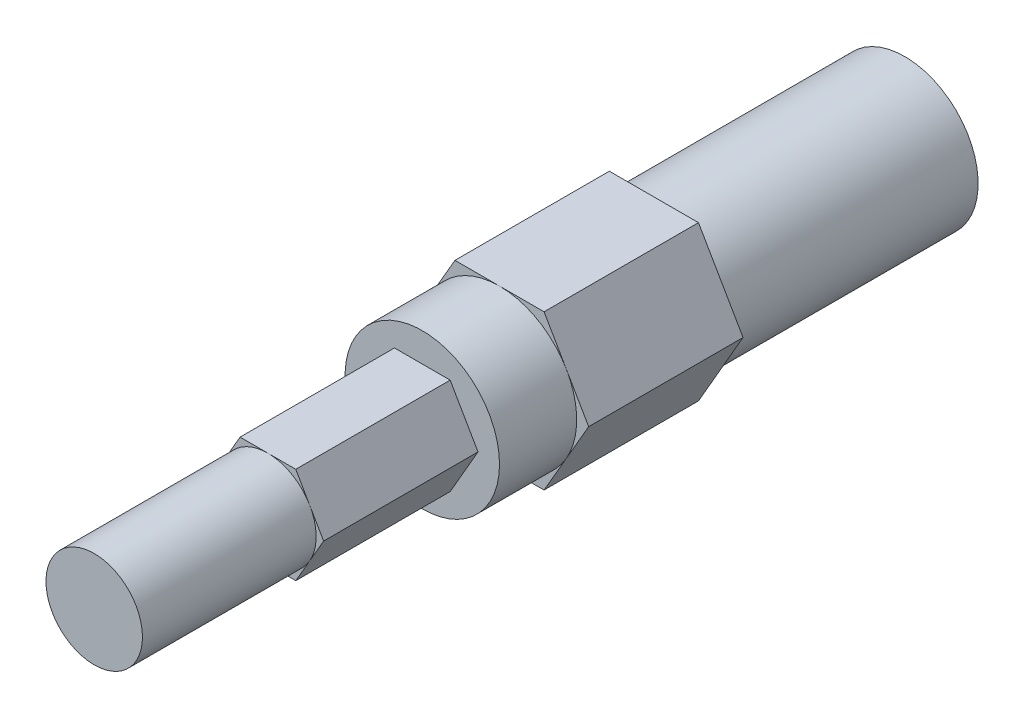
ISO-10303-21;
HEADER;
FILE_DESCRIPTION(('STEP AP214'),'2;1');
FILE_NAME('part.step','',(''),(''),'','','');
FILE_SCHEMA(('AUTOMOTIVE_DESIGN { 1 0 10303 214 1 1 1 1 }'));
ENDSEC;
DATA;
#1=APPLICATION_CONTEXT('core data for automotive mechanical design processes');
#2=APPLICATION_PROTOCOL_DEFINITION('international standard','automotive_design',2000,#1);
#3=PRODUCT_CONTEXT('',#1,'mechanical');
#4=PRODUCT('Part','Part','',(#3));
#5=PRODUCT_RELATED_PRODUCT_CATEGORY('part','',(#4));
#6=PRODUCT_DEFINITION_FORMATION('','',#4);
#7=PRODUCT_DEFINITION_CONTEXT('part definition',#1,'design');
#8=PRODUCT_DEFINITION('design','',#6,#7);
#9=PRODUCT_DEFINITION_SHAPE('','',#8);
#10=(LENGTH_UNIT() NAMED_UNIT(*) SI_UNIT(.MILLI.,.METRE.));
#11=(NAMED_UNIT(*) PLANE_ANGLE_UNIT() SI_UNIT($,.RADIAN.));
#12=(NAMED_UNIT(*) SI_UNIT($,.STERADIAN.) SOLID_ANGLE_UNIT());
#13=UNCERTAINTY_MEASURE_WITH_UNIT(LENGTH_MEASURE(1.E-05),#10,'distance_accuracy_value','');
#14=(GEOMETRIC_REPRESENTATION_CONTEXT(3) GLOBAL_UNCERTAINTY_ASSIGNED_CONTEXT((#13)) GLOBAL_UNIT_ASSIGNED_CONTEXT((#10,
#11,#12)) REPRESENTATION_CONTEXT('',''));
#15=CARTESIAN_POINT('',(0.,0.,0.));
#16=DIRECTION('',(0.,0.,1.));
#17=DIRECTION('',(1.,0.,0.));
#18=AXIS2_PLACEMENT_3D('',#15,#16,#17);
#19=CARTESIAN_POINT('',(0.,0.,13.335));
#20=DIRECTION('',(0.,0.,-1.));
#21=DIRECTION('',(-1.,0.,0.));
#22=AXIS2_PLACEMENT_3D('',#19,#20,#21);
#23=CYLINDRICAL_SURFACE('',#22,2.413);
#24=CARTESIAN_POINT('',(0.,0.,13.335));
#25=DIRECTION('',(0.,0.,1.));
#26=DIRECTION('',(1.,0.,0.));
#27=AXIS2_PLACEMENT_3D('',#24,#25,#26);
#28=CIRCLE('',#27,2.413);
#29=CARTESIAN_POINT('',(2.413,0.,13.335));
#30=VERTEX_POINT('',#29);
#31=EDGE_CURVE('E41',#30,#30,#28,.T.);
#32=ORIENTED_EDGE('',*,*,#31,.F.);
#33=EDGE_LOOP('',(#32));
#34=FACE_BOUND('',#33,.T.);
#35=CARTESIAN_POINT('',(0.,0.,5.08));
#36=DIRECTION('',(0.,0.,-1.));
#37=DIRECTION('',(-1.,0.,0.));
#38=AXIS2_PLACEMENT_3D('',#35,#36,#37);
#39=CIRCLE('',#38,2.413);
#40=CARTESIAN_POINT('',(-2.413,0.,5.08));
#41=VERTEX_POINT('',#40);
#42=EDGE_CURVE('E194',#41,#41,#39,.T.);
#43=ORIENTED_EDGE('',*,*,#42,.F.);
#44=EDGE_LOOP('',(#43));
#45=FACE_BOUND('',#44,.T.);
#46=ADVANCED_FACE('F38',(#34,#45),#23,.T.);
#47=CARTESIAN_POINT('',(0.,0.,26.035));
#48=DIRECTION('',(0.,0.,1.));
#49=DIRECTION('',(1.,0.,0.));
#50=AXIS2_PLACEMENT_3D('',#47,#48,#49);
#51=PLANE('',#50);
#52=CARTESIAN_POINT('',(0.,0.,26.035));
#53=DIRECTION('',(0.,0.,1.));
#54=DIRECTION('',(1.,0.,0.));
#55=AXIS2_PLACEMENT_3D('',#52,#53,#54);
#56=CIRCLE('',#55,1.5875);
#57=CARTESIAN_POINT('',(1.3748153285078,0.79375,26.035));
#58=VERTEX_POINT('',#57);
#59=CARTESIAN_POINT('',(0.,1.5875,26.035));
#60=VERTEX_POINT('',#59);
#61=EDGE_CURVE('E48',#58,#60,#56,.T.);
#62=ORIENTED_EDGE('',*,*,#61,.F.);
#63=DIRECTION('',(-0.5,0.866025403784438,0.));
#64=VECTOR('',#63,1.);
#65=CARTESIAN_POINT('',(1.83308710467706,0.,26.035));
#66=LINE('',#65,#64);
#67=CARTESIAN_POINT('',(0.916543552338529,1.5875,26.035));
#68=VERTEX_POINT('',#67);
#69=EDGE_CURVE('E177',#58,#68,#66,.T.);
#70=ORIENTED_EDGE('',*,*,#69,.T.);
#71=DIRECTION('',(-1.,0.,0.));
#72=VECTOR('',#71,1.);
#73=CARTESIAN_POINT('',(0.916543552338529,1.5875,26.035));
#74=LINE('',#73,#72);
#75=EDGE_CURVE('E191',#68,#60,#74,.T.);
#76=ORIENTED_EDGE('',*,*,#75,.T.);
#77=EDGE_LOOP('',(#62,#70,#76));
#78=FACE_BOUND('',#77,.T.);
#79=ADVANCED_FACE('F190',(#78),#51,.T.);
#80=CARTESIAN_POINT('',(-1.3748153285078,0.79375,26.035));
#81=VERTEX_POINT('',#80);
#82=EDGE_CURVE('E11',#60,#81,#56,.T.);
#83=ORIENTED_EDGE('',*,*,#82,.F.);
#84=CARTESIAN_POINT('',(-0.916543552338531,1.5875,26.035));
#85=VERTEX_POINT('',#84);
#86=EDGE_CURVE('E176',#60,#85,#74,.T.);
#87=ORIENTED_EDGE('',*,*,#86,.T.);
#88=DIRECTION('',(-0.5,-0.866025403784439,0.));
#89=VECTOR('',#88,1.);
#90=CARTESIAN_POINT('',(-0.916543552338531,1.5875,26.035));
#91=LINE('',#90,#89);
#92=EDGE_CURVE('E207',#85,#81,#91,.T.);
#93=ORIENTED_EDGE('',*,*,#92,.T.);
#94=EDGE_LOOP('',(#83,#87,#93));
#95=FACE_BOUND('',#94,.T.);
#96=ADVANCED_FACE('F370',(#95),#51,.T.);
#97=CARTESIAN_POINT('',(-1.3748153285078,-0.793750000000001,26.035));
#98=VERTEX_POINT('',#97);
#99=EDGE_CURVE('E46',#81,#98,#56,.T.);
#100=ORIENTED_EDGE('',*,*,#99,.F.);
#101=CARTESIAN_POINT('',(-1.83308710467706,0.,26.035));
#102=VERTEX_POINT('',#101);
#103=EDGE_CURVE('E206',#81,#102,#91,.T.);
#104=ORIENTED_EDGE('',*,*,#103,.T.);
#105=DIRECTION('',(0.5,-0.866025403784439,0.));
#106=VECTOR('',#105,1.);
#107=CARTESIAN_POINT('',(-1.83308710467706,0.,26.035));
#108=LINE('',#107,#106);
#109=EDGE_CURVE('E211',#102,#98,#108,.T.);
#110=ORIENTED_EDGE('',*,*,#109,.T.);
#111=EDGE_LOOP('',(#100,#104,#110));
#112=FACE_BOUND('',#111,.T.);
#113=ADVANCED_FACE('F458',(#112),#51,.T.);
#114=CARTESIAN_POINT('',(0.,-1.5875,26.035));
#115=VERTEX_POINT('',#114);
#116=EDGE_CURVE('E63',#98,#115,#56,.T.);
#117=ORIENTED_EDGE('',*,*,#116,.F.);
#118=CARTESIAN_POINT('',(-0.916543552338531,-1.5875,26.035));
#119=VERTEX_POINT('',#118);
#120=EDGE_CURVE('E210',#98,#119,#108,.T.);
#121=ORIENTED_EDGE('',*,*,#120,.T.);
#122=DIRECTION('',(1.,0.,0.));
#123=VECTOR('',#122,1.);
#124=CARTESIAN_POINT('',(-0.916543552338531,-1.5875,26.035));
#125=LINE('',#124,#123);
#126=EDGE_CURVE('E215',#119,#115,#125,.T.);
#127=ORIENTED_EDGE('',*,*,#126,.T.);
#128=EDGE_LOOP('',(#117,#121,#127));
#129=FACE_BOUND('',#128,.T.);
#130=ADVANCED_FACE('F454',(#129),#51,.T.);
#131=CARTESIAN_POINT('',(1.3748153285078,-0.79375,26.035));
#132=VERTEX_POINT('',#131);
#133=EDGE_CURVE('E55',#115,#132,#56,.T.);
#134=ORIENTED_EDGE('',*,*,#133,.F.);
#135=CARTESIAN_POINT('',(0.916543552338531,-1.5875,26.035));
#136=VERTEX_POINT('',#135);
#137=EDGE_CURVE('E214',#115,#136,#125,.T.);
#138=ORIENTED_EDGE('',*,*,#137,.T.);
#139=DIRECTION('',(0.5,0.866025403784439,0.));
#140=VECTOR('',#139,1.);
#141=CARTESIAN_POINT('',(0.916543552338531,-1.5875,26.035));
#142=LINE('',#141,#140);
#143=EDGE_CURVE('E188',#136,#132,#142,.T.);
#144=ORIENTED_EDGE('',*,*,#143,.T.);
#145=EDGE_LOOP('',(#134,#138,#144));
#146=FACE_BOUND('',#145,.T.);
#147=ADVANCED_FACE('F391',(#146),#51,.T.);
#148=CARTESIAN_POINT('',(0.,0.,18.415));
#149=DIRECTION('',(0.,0.,1.));
#150=DIRECTION('',(1.,0.,0.));
#151=AXIS2_PLACEMENT_3D('',#148,#149,#150);
#152=PLANE('',#151);
#153=CARTESIAN_POINT('',(0.,0.,18.415));
#154=DIRECTION('',(0.,0.,1.));
#155=DIRECTION('',(1.,0.,0.));
#156=AXIS2_PLACEMENT_3D('',#153,#154,#155);
#157=CIRCLE('',#156,2.54);
#158=CARTESIAN_POINT('',(2.19970452561247,1.27,18.415));
#159=VERTEX_POINT('',#158);
#160=CARTESIAN_POINT('',(0.,2.54,18.415));
#161=VERTEX_POINT('',#160);
#162=EDGE_CURVE('E200',#159,#161,#157,.T.);
#163=ORIENTED_EDGE('',*,*,#162,.F.);
#164=DIRECTION('',(-0.5,0.866025403784439,0.));
#165=VECTOR('',#164,1.);
#166=CARTESIAN_POINT('',(2.9329393674833,0.,18.415));
#167=LINE('',#166,#165);
#168=CARTESIAN_POINT('',(1.46646968374165,2.54,18.415));
#169=VERTEX_POINT('',#168);
#170=EDGE_CURVE('E258',#159,#169,#167,.T.);
#171=ORIENTED_EDGE('',*,*,#170,.T.);
#172=DIRECTION('',(-1.,0.,0.));
#173=VECTOR('',#172,1.);
#174=CARTESIAN_POINT('',(1.46646968374165,2.54,18.415));
#175=LINE('',#174,#173);
#176=EDGE_CURVE('E263',#169,#161,#175,.T.);
#177=ORIENTED_EDGE('',*,*,#176,.T.);
#178=EDGE_LOOP('',(#163,#171,#177));
#179=FACE_BOUND('',#178,.T.);
#180=ADVANCED_FACE('F427',(#179),#152,.T.);
#181=CARTESIAN_POINT('',(-2.19970452561248,1.27,18.415));
#182=VERTEX_POINT('',#181);
#183=EDGE_CURVE('E196',#161,#182,#157,.T.);
#184=ORIENTED_EDGE('',*,*,#183,.F.);
#185=CARTESIAN_POINT('',(-1.46646968374165,2.54,18.415));
#186=VERTEX_POINT('',#185);
#187=EDGE_CURVE('E262',#161,#186,#175,.T.);
#188=ORIENTED_EDGE('',*,*,#187,.T.);
#189=DIRECTION('',(-0.5,-0.866025403784439,0.));
#190=VECTOR('',#189,1.);
#191=CARTESIAN_POINT('',(-1.46646968374165,2.54,18.415));
#192=LINE('',#191,#190);
#193=EDGE_CURVE('E267',#186,#182,#192,.T.);
#194=ORIENTED_EDGE('',*,*,#193,.T.);
#195=EDGE_LOOP('',(#184,#188,#194));
#196=FACE_BOUND('',#195,.T.);
#197=ADVANCED_FACE('F329',(#196),#152,.T.);
#198=CARTESIAN_POINT('',(-2.19970452561248,-1.27,18.415));
#199=VERTEX_POINT('',#198);
#200=EDGE_CURVE('E198',#182,#199,#157,.T.);
#201=ORIENTED_EDGE('',*,*,#200,.F.);
#202=CARTESIAN_POINT('',(-2.9329393674833,0.,18.415));
#203=VERTEX_POINT('',#202);
#204=EDGE_CURVE('E266',#182,#203,#192,.T.);
#205=ORIENTED_EDGE('',*,*,#204,.T.);
#206=DIRECTION('',(0.5,-0.866025403784439,0.));
#207=VECTOR('',#206,1.);
#208=CARTESIAN_POINT('',(-2.9329393674833,0.,18.415));
#209=LINE('',#208,#207);
#210=EDGE_CURVE('E271',#203,#199,#209,.T.);
#211=ORIENTED_EDGE('',*,*,#210,.T.);
#212=EDGE_LOOP('',(#201,#205,#211));
#213=FACE_BOUND('',#212,.T.);
#214=ADVANCED_FACE('F322',(#213),#152,.T.);
#215=CARTESIAN_POINT('',(0.,-2.54,18.415));
#216=VERTEX_POINT('',#215);
#217=EDGE_CURVE('E316',#199,#216,#157,.T.);
#218=ORIENTED_EDGE('',*,*,#217,.F.);
#219=CARTESIAN_POINT('',(-1.46646968374165,-2.54,18.415));
#220=VERTEX_POINT('',#219);
#221=EDGE_CURVE('E270',#199,#220,#209,.T.);
#222=ORIENTED_EDGE('',*,*,#221,.T.);
#223=DIRECTION('',(1.,0.,0.));
#224=VECTOR('',#223,1.);
#225=CARTESIAN_POINT('',(-1.46646968374165,-2.54,18.415));
#226=LINE('',#225,#224);
#227=EDGE_CURVE('E275',#220,#216,#226,.T.);
#228=ORIENTED_EDGE('',*,*,#227,.T.);
#229=EDGE_LOOP('',(#218,#222,#228));
#230=FACE_BOUND('',#229,.T.);
#231=ADVANCED_FACE('F352',(#230),#152,.T.);
#232=CARTESIAN_POINT('',(2.19970452561248,-1.27,18.415));
#233=VERTEX_POINT('',#232);
#234=EDGE_CURVE('E313',#216,#233,#157,.T.);
#235=ORIENTED_EDGE('',*,*,#234,.F.);
#236=CARTESIAN_POINT('',(1.46646968374165,-2.54,18.415));
#237=VERTEX_POINT('',#236);
#238=EDGE_CURVE('E274',#216,#237,#226,.T.);
#239=ORIENTED_EDGE('',*,*,#238,.T.);
#240=DIRECTION('',(0.5,0.866025403784439,0.));
#241=VECTOR('',#240,1.);
#242=CARTESIAN_POINT('',(1.46646968374165,-2.54,18.415));
#243=LINE('',#242,#241);
#244=EDGE_CURVE('E255',#237,#233,#243,.T.);
#245=ORIENTED_EDGE('',*,*,#244,.T.);
#246=EDGE_LOOP('',(#235,#239,#245));
#247=FACE_BOUND('',#246,.T.);
#248=ADVANCED_FACE('F354',(#247),#152,.T.);
#249=CARTESIAN_POINT('',(1.46646968374165,-2.54,18.415));
#250=DIRECTION('',(-0.866025403784439,0.5,0.));
#251=DIRECTION('',(-0.5,-0.866025403784439,0.));
#252=AXIS2_PLACEMENT_3D('',#249,#250,#251);
#253=PLANE('',#252);
#254=DIRECTION('',(0.5,0.866025403784439,0.));
#255=VECTOR('',#254,1.);
#256=CARTESIAN_POINT('',(1.46646968374165,-2.54,13.335));
#257=LINE('',#256,#255);
#258=CARTESIAN_POINT('',(1.46646968374165,-2.54,13.335));
#259=VERTEX_POINT('',#258);
#260=CARTESIAN_POINT('',(2.9329393674833,0.,13.335));
#261=VERTEX_POINT('',#260);
#262=EDGE_CURVE('E251',#259,#261,#257,.T.);
#263=ORIENTED_EDGE('',*,*,#262,.T.);
#264=DIRECTION('',(0.,0.,-1.));
#265=VECTOR('',#264,1.);
#266=CARTESIAN_POINT('',(2.9329393674833,0.,18.415));
#267=LINE('',#266,#265);
#268=CARTESIAN_POINT('',(2.9329393674833,0.,18.415));
#269=VERTEX_POINT('',#268);
#270=EDGE_CURVE('E304',#269,#261,#267,.T.);
#271=ORIENTED_EDGE('',*,*,#270,.F.);
#272=EDGE_CURVE('E259',#233,#269,#243,.T.);
#273=ORIENTED_EDGE('',*,*,#272,.F.);
#274=ORIENTED_EDGE('',*,*,#244,.F.);
#275=DIRECTION('',(0.,0.,-1.));
#276=VECTOR('',#275,1.);
#277=CARTESIAN_POINT('',(1.46646968374165,-2.54,18.415));
#278=LINE('',#277,#276);
#279=EDGE_CURVE('E278',#237,#259,#278,.T.);
#280=ORIENTED_EDGE('',*,*,#279,.T.);
#281=EDGE_LOOP('',(#263,#271,#273,#274,#280));
#282=FACE_BOUND('',#281,.T.);
#283=ADVANCED_FACE('F360',(#282),#253,.F.);
#284=CARTESIAN_POINT('',(2.9329393674833,0.,18.415));
#285=DIRECTION('',(-0.866025403784439,-0.5,0.));
#286=DIRECTION('',(0.5,-0.866025403784439,0.));
#287=AXIS2_PLACEMENT_3D('',#284,#285,#286);
#288=PLANE('',#287);
#289=DIRECTION('',(-0.5,0.866025403784439,0.));
#290=VECTOR('',#289,1.);
#291=CARTESIAN_POINT('',(2.9329393674833,0.,13.335));
#292=LINE('',#291,#290);
#293=CARTESIAN_POINT('',(1.46646968374165,2.54,13.335));
#294=VERTEX_POINT('',#293);
#295=EDGE_CURVE('E281',#261,#294,#292,.T.);
#296=ORIENTED_EDGE('',*,*,#295,.T.);
#297=DIRECTION('',(0.,0.,-1.));
#298=VECTOR('',#297,1.);
#299=CARTESIAN_POINT('',(1.46646968374165,2.54,18.415));
#300=LINE('',#299,#298);
#301=EDGE_CURVE('E302',#169,#294,#300,.T.);
#302=ORIENTED_EDGE('',*,*,#301,.F.);
#303=ORIENTED_EDGE('',*,*,#170,.F.);
#304=EDGE_CURVE('E260',#269,#159,#167,.T.);
#305=ORIENTED_EDGE('',*,*,#304,.F.);
#306=ORIENTED_EDGE('',*,*,#270,.T.);
#307=EDGE_LOOP('',(#296,#302,#303,#305,#306));
#308=FACE_BOUND('',#307,.T.);
#309=ADVANCED_FACE('F437',(#308),#288,.F.);
#310=CARTESIAN_POINT('',(1.46646968374165,2.54,18.415));
#311=DIRECTION('',(0.,-1.,0.));
#312=DIRECTION('',(0.,0.,-1.));
#313=AXIS2_PLACEMENT_3D('',#310,#311,#312);
#314=PLANE('',#313);
#315=DIRECTION('',(-1.,0.,0.));
#316=VECTOR('',#315,1.);
#317=CARTESIAN_POINT('',(1.46646968374165,2.54,13.335));
#318=LINE('',#317,#316);
#319=CARTESIAN_POINT('',(-1.46646968374165,2.54,13.335));
#320=VERTEX_POINT('',#319);
#321=EDGE_CURVE('E283',#294,#320,#318,.T.);
#322=ORIENTED_EDGE('',*,*,#321,.T.);
#323=DIRECTION('',(0.,0.,-1.));
#324=VECTOR('',#323,1.);
#325=CARTESIAN_POINT('',(-1.46646968374165,2.54,18.415));
#326=LINE('',#325,#324);
#327=EDGE_CURVE('E299',#186,#320,#326,.T.);
#328=ORIENTED_EDGE('',*,*,#327,.F.);
#329=ORIENTED_EDGE('',*,*,#187,.F.);
#330=ORIENTED_EDGE('',*,*,#176,.F.);
#331=ORIENTED_EDGE('',*,*,#301,.T.);
#332=EDGE_LOOP('',(#322,#328,#329,#330,#331));
#333=FACE_BOUND('',#332,.T.);
#334=ADVANCED_FACE('F334',(#333),#314,.F.);
#335=CARTESIAN_POINT('',(-1.46646968374165,2.54,18.415));
#336=DIRECTION('',(0.866025403784439,-0.5,0.));
#337=DIRECTION('',(0.5,0.866025403784439,0.));
#338=AXIS2_PLACEMENT_3D('',#335,#336,#337);
#339=PLANE('',#338);
#340=DIRECTION('',(-0.5,-0.866025403784439,0.));
#341=VECTOR('',#340,1.);
#342=CARTESIAN_POINT('',(-1.46646968374165,2.54,13.335));
#343=LINE('',#342,#341);
#344=CARTESIAN_POINT('',(-2.9329393674833,0.,13.335));
#345=VERTEX_POINT('',#344);
#346=EDGE_CURVE('E285',#320,#345,#343,.T.);
#347=ORIENTED_EDGE('',*,*,#346,.T.);
#348=DIRECTION('',(0.,0.,-1.));
#349=VECTOR('',#348,1.);
#350=CARTESIAN_POINT('',(-2.9329393674833,0.,18.415));
#351=LINE('',#350,#349);
#352=EDGE_CURVE('E296',#203,#345,#351,.T.);
#353=ORIENTED_EDGE('',*,*,#352,.F.);
#354=ORIENTED_EDGE('',*,*,#204,.F.);
#355=ORIENTED_EDGE('',*,*,#193,.F.);
#356=ORIENTED_EDGE('',*,*,#327,.T.);
#357=EDGE_LOOP('',(#347,#353,#354,#355,#356));
#358=FACE_BOUND('',#357,.T.);
#359=ADVANCED_FACE('F327',(#358),#339,.F.);
#360=CARTESIAN_POINT('',(-2.9329393674833,0.,18.415));
#361=DIRECTION('',(0.866025403784439,0.5,0.));
#362=DIRECTION('',(-0.5,0.866025403784439,0.));
#363=AXIS2_PLACEMENT_3D('',#360,#361,#362);
#364=PLANE('',#363);
#365=DIRECTION('',(0.5,-0.866025403784439,0.));
#366=VECTOR('',#365,1.);
#367=CARTESIAN_POINT('',(-2.9329393674833,0.,13.335));
#368=LINE('',#367,#366);
#369=CARTESIAN_POINT('',(-1.46646968374165,-2.54,13.335));
#370=VERTEX_POINT('',#369);
#371=EDGE_CURVE('E287',#345,#370,#368,.T.);
#372=ORIENTED_EDGE('',*,*,#371,.T.);
#373=DIRECTION('',(0.,0.,-1.));
#374=VECTOR('',#373,1.);
#375=CARTESIAN_POINT('',(-1.46646968374165,-2.54,18.415));
#376=LINE('',#375,#374);
#377=EDGE_CURVE('E293',#220,#370,#376,.T.);
#378=ORIENTED_EDGE('',*,*,#377,.F.);
#379=ORIENTED_EDGE('',*,*,#221,.F.);
#380=ORIENTED_EDGE('',*,*,#210,.F.);
#381=ORIENTED_EDGE('',*,*,#352,.T.);
#382=EDGE_LOOP('',(#372,#378,#379,#380,#381));
#383=FACE_BOUND('',#382,.T.);
#384=ADVANCED_FACE('F344',(#383),#364,.F.);
#385=CARTESIAN_POINT('',(-1.46646968374165,-2.54,18.415));
#386=DIRECTION('',(0.,1.,0.));
#387=DIRECTION('',(-1.,0.,0.));
#388=AXIS2_PLACEMENT_3D('',#385,#386,#387);
#389=PLANE('',#388);
#390=DIRECTION('',(1.,0.,0.));
#391=VECTOR('',#390,1.);
#392=CARTESIAN_POINT('',(-1.46646968374165,-2.54,13.335));
#393=LINE('',#392,#391);
#394=EDGE_CURVE('E289',#370,#259,#393,.T.);
#395=ORIENTED_EDGE('',*,*,#394,.T.);
#396=ORIENTED_EDGE('',*,*,#279,.F.);
#397=ORIENTED_EDGE('',*,*,#238,.F.);
#398=ORIENTED_EDGE('',*,*,#227,.F.);
#399=ORIENTED_EDGE('',*,*,#377,.T.);
#400=EDGE_LOOP('',(#395,#396,#397,#398,#399));
#401=FACE_BOUND('',#400,.T.);
#402=ADVANCED_FACE('F348',(#401),#389,.F.);
#403=EDGE_CURVE('E254',#233,#159,#157,.T.);
#404=ORIENTED_EDGE('',*,*,#403,.F.);
#405=ORIENTED_EDGE('',*,*,#272,.T.);
#406=ORIENTED_EDGE('',*,*,#304,.T.);
#407=EDGE_LOOP('',(#404,#405,#406));
#408=FACE_BOUND('',#407,.T.);
#409=ADVANCED_FACE('F362',(#408),#152,.T.);
#410=CARTESIAN_POINT('',(0.,0.,13.335));
#411=DIRECTION('',(0.,0.,1.));
#412=DIRECTION('',(1.,0.,0.));
#413=AXIS2_PLACEMENT_3D('',#410,#411,#412);
#414=PLANE('',#413);
#415=ORIENTED_EDGE('',*,*,#31,.T.);
#416=EDGE_LOOP('',(#415));
#417=FACE_BOUND('',#416,.T.);
#418=ORIENTED_EDGE('',*,*,#262,.F.);
#419=ORIENTED_EDGE('',*,*,#394,.F.);
#420=ORIENTED_EDGE('',*,*,#371,.F.);
#421=ORIENTED_EDGE('',*,*,#346,.F.);
#422=ORIENTED_EDGE('',*,*,#321,.F.);
#423=ORIENTED_EDGE('',*,*,#295,.F.);
#424=EDGE_LOOP('',(#418,#419,#420,#421,#422,#423));
#425=FACE_BOUND('',#424,.T.);
#426=ADVANCED_FACE('F340',(#417,#425),#414,.F.);
#427=CARTESIAN_POINT('',(0.,0.,20.955));
#428=DIRECTION('',(0.,0.,-1.));
#429=DIRECTION('',(-1.,0.,0.));
#430=AXIS2_PLACEMENT_3D('',#427,#428,#429);
#431=CYLINDRICAL_SURFACE('',#430,2.54);
#432=CARTESIAN_POINT('',(0.,0.,20.955));
#433=DIRECTION('',(0.,0.,1.));
#434=DIRECTION('',(1.,0.,0.));
#435=AXIS2_PLACEMENT_3D('',#432,#433,#434);
#436=CIRCLE('',#435,2.54);
#437=CARTESIAN_POINT('',(2.54,0.,20.955));
#438=VERTEX_POINT('',#437);
#439=EDGE_CURVE('E249',#438,#438,#436,.T.);
#440=ORIENTED_EDGE('',*,*,#439,.F.);
#441=EDGE_LOOP('',(#440));
#442=FACE_BOUND('',#441,.T.);
#443=ORIENTED_EDGE('',*,*,#162,.T.);
#444=ORIENTED_EDGE('',*,*,#183,.T.);
#445=ORIENTED_EDGE('',*,*,#200,.T.);
#446=ORIENTED_EDGE('',*,*,#217,.T.);
#447=ORIENTED_EDGE('',*,*,#234,.T.);
#448=ORIENTED_EDGE('',*,*,#403,.T.);
#449=EDGE_LOOP('',(#443,#444,#445,#446,#447,#448));
#450=FACE_BOUND('',#449,.T.);
#451=ADVANCED_FACE('F319',(#442,#450),#431,.T.);
#452=CARTESIAN_POINT('',(0.,0.,20.955));
#453=DIRECTION('',(0.,0.,1.));
#454=DIRECTION('',(1.,0.,0.));
#455=AXIS2_PLACEMENT_3D('',#452,#453,#454);
#456=PLANE('',#455);
#457=DIRECTION('',(0.5,0.866025403784439,0.));
#458=VECTOR('',#457,1.);
#459=CARTESIAN_POINT('',(0.916543552338531,-1.5875,20.955));
#460=LINE('',#459,#458);
#461=CARTESIAN_POINT('',(0.916543552338531,-1.5875,20.955));
#462=VERTEX_POINT('',#461);
#463=CARTESIAN_POINT('',(1.83308710467706,0.,20.955));
#464=VERTEX_POINT('',#463);
#465=EDGE_CURVE('E218',#462,#464,#460,.T.);
#466=ORIENTED_EDGE('',*,*,#465,.F.);
#467=DIRECTION('',(1.,0.,0.));
#468=VECTOR('',#467,1.);
#469=CARTESIAN_POINT('',(-0.916543552338531,-1.5875,20.955));
#470=LINE('',#469,#468);
#471=CARTESIAN_POINT('',(-0.916543552338531,-1.5875,20.955));
#472=VERTEX_POINT('',#471);
#473=EDGE_CURVE('E232',#472,#462,#470,.T.);
#474=ORIENTED_EDGE('',*,*,#473,.F.);
#475=DIRECTION('',(0.5,-0.866025403784439,0.));
#476=VECTOR('',#475,1.);
#477=CARTESIAN_POINT('',(-1.83308710467706,0.,20.955));
#478=LINE('',#477,#476);
#479=CARTESIAN_POINT('',(-1.83308710467706,0.,20.955));
#480=VERTEX_POINT('',#479);
#481=EDGE_CURVE('E229',#480,#472,#478,.T.);
#482=ORIENTED_EDGE('',*,*,#481,.F.);
#483=DIRECTION('',(-0.5,-0.866025403784439,0.));
#484=VECTOR('',#483,1.);
#485=CARTESIAN_POINT('',(-0.916543552338531,1.5875,20.955));
#486=LINE('',#485,#484);
#487=CARTESIAN_POINT('',(-0.916543552338531,1.5875,20.955));
#488=VERTEX_POINT('',#487);
#489=EDGE_CURVE('E226',#488,#480,#486,.T.);
#490=ORIENTED_EDGE('',*,*,#489,.F.);
#491=DIRECTION('',(-1.,0.,0.));
#492=VECTOR('',#491,1.);
#493=CARTESIAN_POINT('',(0.916543552338529,1.5875,20.955));
#494=LINE('',#493,#492);
#495=CARTESIAN_POINT('',(0.916543552338529,1.5875,20.955));
#496=VERTEX_POINT('',#495);
#497=EDGE_CURVE('E223',#496,#488,#494,.T.);
#498=ORIENTED_EDGE('',*,*,#497,.F.);
#499=DIRECTION('',(-0.5,0.866025403784438,0.));
#500=VECTOR('',#499,1.);
#501=CARTESIAN_POINT('',(1.83308710467706,0.,20.955));
#502=LINE('',#501,#500);
#503=EDGE_CURVE('E221',#464,#496,#502,.T.);
#504=ORIENTED_EDGE('',*,*,#503,.F.);
#505=EDGE_LOOP('',(#466,#474,#482,#490,#498,#504));
#506=FACE_BOUND('',#505,.T.);
#507=ORIENTED_EDGE('',*,*,#439,.T.);
#508=EDGE_LOOP('',(#507));
#509=FACE_BOUND('',#508,.T.);
#510=ADVANCED_FACE('F412',(#506,#509),#456,.T.);
#511=CARTESIAN_POINT('',(0.916543552338531,-1.5875,26.035));
#512=DIRECTION('',(-0.866025403784439,0.5,0.));
#513=DIRECTION('',(-0.5,-0.866025403784439,0.));
#514=AXIS2_PLACEMENT_3D('',#511,#512,#513);
#515=PLANE('',#514);
#516=ORIENTED_EDGE('',*,*,#465,.T.);
#517=DIRECTION('',(0.,0.,-1.));
#518=VECTOR('',#517,1.);
#519=CARTESIAN_POINT('',(1.83308710467706,0.,26.035));
#520=LINE('',#519,#518);
#521=CARTESIAN_POINT('',(1.83308710467706,0.,26.035));
#522=VERTEX_POINT('',#521);
#523=EDGE_CURVE('E247',#522,#464,#520,.T.);
#524=ORIENTED_EDGE('',*,*,#523,.F.);
#525=EDGE_CURVE('E172',#132,#522,#142,.T.);
#526=ORIENTED_EDGE('',*,*,#525,.F.);
#527=ORIENTED_EDGE('',*,*,#143,.F.);
#528=DIRECTION('',(0.,0.,-1.));
#529=VECTOR('',#528,1.);
#530=CARTESIAN_POINT('',(0.916543552338531,-1.5875,26.035));
#531=LINE('',#530,#529);
#532=EDGE_CURVE('E217',#136,#462,#531,.T.);
#533=ORIENTED_EDGE('',*,*,#532,.T.);
#534=EDGE_LOOP('',(#516,#524,#526,#527,#533));
#535=FACE_BOUND('',#534,.T.);
#536=ADVANCED_FACE('F409',(#535),#515,.F.);
#537=CARTESIAN_POINT('',(1.83308710467706,0.,26.035));
#538=DIRECTION('',(-0.866025403784438,-0.5,0.));
#539=DIRECTION('',(0.5,-0.866025403784439,0.));
#540=AXIS2_PLACEMENT_3D('',#537,#538,#539);
#541=PLANE('',#540);
#542=ORIENTED_EDGE('',*,*,#503,.T.);
#543=DIRECTION('',(0.,0.,-1.));
#544=VECTOR('',#543,1.);
#545=CARTESIAN_POINT('',(0.916543552338529,1.5875,26.035));
#546=LINE('',#545,#544);
#547=EDGE_CURVE('E184',#68,#496,#546,.T.);
#548=ORIENTED_EDGE('',*,*,#547,.F.);
#549=ORIENTED_EDGE('',*,*,#69,.F.);
#550=EDGE_CURVE('E166',#522,#58,#66,.T.);
#551=ORIENTED_EDGE('',*,*,#550,.F.);
#552=ORIENTED_EDGE('',*,*,#523,.T.);
#553=EDGE_LOOP('',(#542,#548,#549,#551,#552));
#554=FACE_BOUND('',#553,.T.);
#555=ADVANCED_FACE('F182',(#554),#541,.F.);
#556=CARTESIAN_POINT('',(0.916543552338529,1.5875,26.035));
#557=DIRECTION('',(0.,-1.,0.));
#558=DIRECTION('',(0.,0.,-1.));
#559=AXIS2_PLACEMENT_3D('',#556,#557,#558);
#560=PLANE('',#559);
#561=ORIENTED_EDGE('',*,*,#497,.T.);
#562=DIRECTION('',(0.,0.,-1.));
#563=VECTOR('',#562,1.);
#564=CARTESIAN_POINT('',(-0.916543552338531,1.5875,26.035));
#565=LINE('',#564,#563);
#566=EDGE_CURVE('E243',#85,#488,#565,.T.);
#567=ORIENTED_EDGE('',*,*,#566,.F.);
#568=ORIENTED_EDGE('',*,*,#86,.F.);
#569=ORIENTED_EDGE('',*,*,#75,.F.);
#570=ORIENTED_EDGE('',*,*,#547,.T.);
#571=EDGE_LOOP('',(#561,#567,#568,#569,#570));
#572=FACE_BOUND('',#571,.T.);
#573=ADVANCED_FACE('F402',(#572),#560,.F.);
#574=CARTESIAN_POINT('',(-0.916543552338531,1.5875,26.035));
#575=DIRECTION('',(0.866025403784439,-0.5,0.));
#576=DIRECTION('',(0.5,0.866025403784439,0.));
#577=AXIS2_PLACEMENT_3D('',#574,#575,#576);
#578=PLANE('',#577);
#579=ORIENTED_EDGE('',*,*,#489,.T.);
#580=DIRECTION('',(0.,0.,-1.));
#581=VECTOR('',#580,1.);
#582=CARTESIAN_POINT('',(-1.83308710467706,0.,26.035));
#583=LINE('',#582,#581);
#584=EDGE_CURVE('E240',#102,#480,#583,.T.);
#585=ORIENTED_EDGE('',*,*,#584,.F.);
#586=ORIENTED_EDGE('',*,*,#103,.F.);
#587=ORIENTED_EDGE('',*,*,#92,.F.);
#588=ORIENTED_EDGE('',*,*,#566,.T.);
#589=EDGE_LOOP('',(#579,#585,#586,#587,#588));
#590=FACE_BOUND('',#589,.T.);
#591=ADVANCED_FACE('F398',(#590),#578,.F.);
#592=CARTESIAN_POINT('',(-1.83308710467706,0.,26.035));
#593=DIRECTION('',(0.866025403784439,0.5,0.));
#594=DIRECTION('',(-0.5,0.866025403784439,0.));
#595=AXIS2_PLACEMENT_3D('',#592,#593,#594);
#596=PLANE('',#595);
#597=ORIENTED_EDGE('',*,*,#481,.T.);
#598=DIRECTION('',(0.,0.,-1.));
#599=VECTOR('',#598,1.);
#600=CARTESIAN_POINT('',(-0.916543552338531,-1.5875,26.035));
#601=LINE('',#600,#599);
#602=EDGE_CURVE('E237',#119,#472,#601,.T.);
#603=ORIENTED_EDGE('',*,*,#602,.F.);
#604=ORIENTED_EDGE('',*,*,#120,.F.);
#605=ORIENTED_EDGE('',*,*,#109,.F.);
#606=ORIENTED_EDGE('',*,*,#584,.T.);
#607=EDGE_LOOP('',(#597,#603,#604,#605,#606));
#608=FACE_BOUND('',#607,.T.);
#609=ADVANCED_FACE('F394',(#608),#596,.F.);
#610=CARTESIAN_POINT('',(-0.916543552338531,-1.5875,26.035));
#611=DIRECTION('',(0.,1.,0.));
#612=DIRECTION('',(-1.,0.,0.));
#613=AXIS2_PLACEMENT_3D('',#610,#611,#612);
#614=PLANE('',#613);
#615=ORIENTED_EDGE('',*,*,#473,.T.);
#616=ORIENTED_EDGE('',*,*,#532,.F.);
#617=ORIENTED_EDGE('',*,*,#137,.F.);
#618=ORIENTED_EDGE('',*,*,#126,.F.);
#619=ORIENTED_EDGE('',*,*,#602,.T.);
#620=EDGE_LOOP('',(#615,#616,#617,#618,#619));
#621=FACE_BOUND('',#620,.T.);
#622=ADVANCED_FACE('F390',(#621),#614,.F.);
#623=EDGE_CURVE('E170',#132,#58,#56,.T.);
#624=ORIENTED_EDGE('',*,*,#623,.F.);
#625=ORIENTED_EDGE('',*,*,#525,.T.);
#626=ORIENTED_EDGE('',*,*,#550,.T.);
#627=EDGE_LOOP('',(#624,#625,#626));
#628=FACE_BOUND('',#627,.T.);
#629=ADVANCED_FACE('F168',(#628),#51,.T.);
#630=CARTESIAN_POINT('',(0.,0.,31.75));
#631=DIRECTION('',(0.,0.,-1.));
#632=DIRECTION('',(-1.,0.,0.));
#633=AXIS2_PLACEMENT_3D('',#630,#631,#632);
#634=CYLINDRICAL_SURFACE('',#633,1.5875);
#635=CARTESIAN_POINT('',(0.,0.,31.75));
#636=DIRECTION('',(0.,0.,1.));
#637=DIRECTION('',(1.,0.,0.));
#638=AXIS2_PLACEMENT_3D('',#635,#636,#637);
#639=CIRCLE('',#638,1.5875);
#640=CARTESIAN_POINT('',(1.5875,0.,31.75));
#641=VERTEX_POINT('',#640);
#642=EDGE_CURVE('E193',#641,#641,#639,.T.);
#643=ORIENTED_EDGE('',*,*,#642,.F.);
#644=EDGE_LOOP('',(#643));
#645=FACE_BOUND('',#644,.T.);
#646=ORIENTED_EDGE('',*,*,#61,.T.);
#647=ORIENTED_EDGE('',*,*,#82,.T.);
#648=ORIENTED_EDGE('',*,*,#99,.T.);
#649=ORIENTED_EDGE('',*,*,#116,.T.);
#650=ORIENTED_EDGE('',*,*,#133,.T.);
#651=ORIENTED_EDGE('',*,*,#623,.T.);
#652=EDGE_LOOP('',(#646,#647,#648,#649,#650,#651));
#653=FACE_BOUND('',#652,.T.);
#654=ADVANCED_FACE('F195',(#645,#653),#634,.T.);
#655=CARTESIAN_POINT('',(0.,0.,31.75));
#656=DIRECTION('',(0.,0.,1.));
#657=DIRECTION('',(1.,0.,0.));
#658=AXIS2_PLACEMENT_3D('',#655,#656,#657);
#659=PLANE('',#658);
#660=ORIENTED_EDGE('',*,*,#642,.T.);
#661=EDGE_LOOP('',(#660));
#662=FACE_BOUND('',#661,.T.);
#663=ADVANCED_FACE('F378',(#662),#659,.T.);
#664=CARTESIAN_POINT('',(0.,0.,5.08));
#665=DIRECTION('',(0.,0.,-1.));
#666=DIRECTION('',(-1.,0.,0.));
#667=AXIS2_PLACEMENT_3D('',#664,#665,#666);
#668=PLANE('',#667);
#669=ORIENTED_EDGE('',*,*,#42,.T.);
#670=EDGE_LOOP('',(#669));
#671=FACE_BOUND('',#670,.T.);
#672=ADVANCED_FACE('F376',(#671),#668,.T.);
#673=CLOSED_SHELL('',(#46,#79,#96,#113,#130,#147,#180,#197,#214,#231,#248,#283,#309,#334,#359,
#384,#402,#409,#426,#451,#510,#536,#555,#573,#591,#609,#622,#629,#654,#663,#672));
#674=MANIFOLD_SOLID_BREP('B2',#673);
#675=ADVANCED_BREP_SHAPE_REPRESENTATION('',(#18,#674),#14);
#676=SHAPE_DEFINITION_REPRESENTATION(#9,#675);
ENDSEC;
END-ISO-10303-21;
